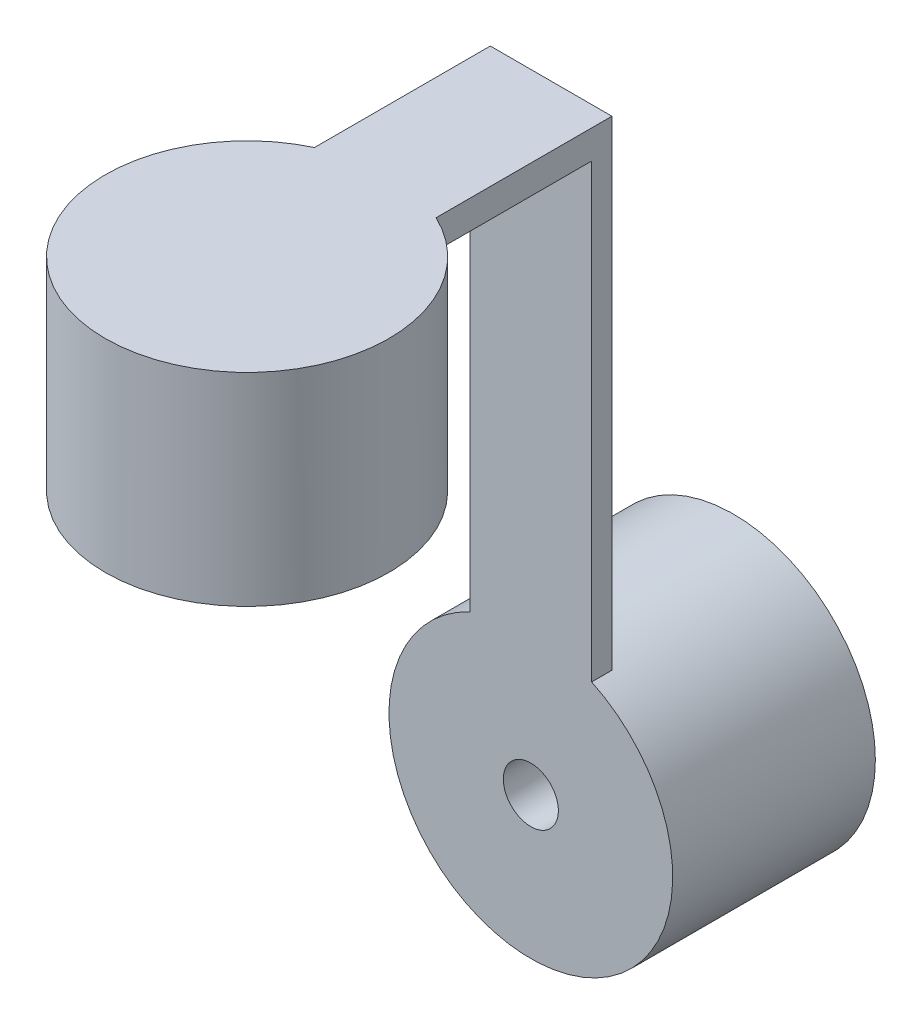
ISO-10303-21;
HEADER;
FILE_DESCRIPTION(('STEP AP214'),'2;1');
FILE_NAME('part.step','',(''),(''),'','','');
FILE_SCHEMA(('AUTOMOTIVE_DESIGN { 1 0 10303 214 1 1 1 1 }'));
ENDSEC;
DATA;
#1=APPLICATION_CONTEXT('core data for automotive mechanical design processes');
#2=APPLICATION_PROTOCOL_DEFINITION('international standard','automotive_design',2000,#1);
#3=PRODUCT_CONTEXT('',#1,'mechanical');
#4=PRODUCT('Part','Part','',(#3));
#5=PRODUCT_RELATED_PRODUCT_CATEGORY('part','',(#4));
#6=PRODUCT_DEFINITION_FORMATION('','',#4);
#7=PRODUCT_DEFINITION_CONTEXT('part definition',#1,'design');
#8=PRODUCT_DEFINITION('design','',#6,#7);
#9=PRODUCT_DEFINITION_SHAPE('','',#8);
#10=(LENGTH_UNIT() NAMED_UNIT(*) SI_UNIT(.MILLI.,.METRE.));
#11=(NAMED_UNIT(*) PLANE_ANGLE_UNIT() SI_UNIT($,.RADIAN.));
#12=(NAMED_UNIT(*) SI_UNIT($,.STERADIAN.) SOLID_ANGLE_UNIT());
#13=UNCERTAINTY_MEASURE_WITH_UNIT(LENGTH_MEASURE(1.E-05),#10,'distance_accuracy_value','');
#14=(GEOMETRIC_REPRESENTATION_CONTEXT(3) GLOBAL_UNCERTAINTY_ASSIGNED_CONTEXT((#13)) GLOBAL_UNIT_ASSIGNED_CONTEXT((#10,
#11,#12)) REPRESENTATION_CONTEXT('',''));
#15=CARTESIAN_POINT('',(0.,0.,0.));
#16=DIRECTION('',(0.,0.,1.));
#17=DIRECTION('',(1.,0.,0.));
#18=AXIS2_PLACEMENT_3D('',#15,#16,#17);
#19=CARTESIAN_POINT('',(0.,0.,50.));
#20=DIRECTION('',(0.,0.,-1.));
#21=DIRECTION('',(-1.,0.,0.));
#22=AXIS2_PLACEMENT_3D('',#19,#20,#21);
#23=CYLINDRICAL_SURFACE('',#22,35.);
#24=CARTESIAN_POINT('',(0.,0.,0.));
#25=DIRECTION('',(0.,0.,1.));
#26=DIRECTION('',(1.,0.,0.));
#27=AXIS2_PLACEMENT_3D('',#24,#25,#26);
#28=CIRCLE('',#27,35.);
#29=CARTESIAN_POINT('',(35.,0.,0.));
#30=VERTEX_POINT('',#29);
#31=EDGE_CURVE('E146',#30,#30,#28,.T.);
#32=ORIENTED_EDGE('',*,*,#31,.T.);
#33=EDGE_LOOP('',(#32));
#34=FACE_BOUND('',#33,.T.);
#35=DIRECTION('',(0.,0.,-1.));
#36=VECTOR('',#35,1.);
#37=CARTESIAN_POINT('',(-15.,31.6227766016838,50.));
#38=LINE('',#37,#36);
#39=CARTESIAN_POINT('',(-15.,31.6227766016838,45.));
#40=VERTEX_POINT('',#39);
#41=CARTESIAN_POINT('',(-15.,31.6227766016838,50.));
#42=VERTEX_POINT('',#41);
#43=EDGE_CURVE('E143',#40,#42,#38,.F.);
#44=ORIENTED_EDGE('',*,*,#43,.F.);
#45=CARTESIAN_POINT('',(0.,0.,45.));
#46=DIRECTION('',(0.,0.,1.));
#47=DIRECTION('',(1.,0.,0.));
#48=AXIS2_PLACEMENT_3D('',#45,#46,#47);
#49=CIRCLE('',#48,35.);
#50=CARTESIAN_POINT('',(15.,31.6227766016838,45.));
#51=VERTEX_POINT('',#50);
#52=EDGE_CURVE('E57',#51,#40,#49,.T.);
#53=ORIENTED_EDGE('',*,*,#52,.F.);
#54=DIRECTION('',(0.,0.,-1.));
#55=VECTOR('',#54,1.);
#56=CARTESIAN_POINT('',(15.,31.6227766016838,50.));
#57=LINE('',#56,#55);
#58=CARTESIAN_POINT('',(15.,31.6227766016838,50.));
#59=VERTEX_POINT('',#58);
#60=EDGE_CURVE('E141',#59,#51,#57,.T.);
#61=ORIENTED_EDGE('',*,*,#60,.F.);
#62=CARTESIAN_POINT('',(0.,0.,50.));
#63=DIRECTION('',(0.,0.,1.));
#64=DIRECTION('',(1.,0.,0.));
#65=AXIS2_PLACEMENT_3D('',#62,#63,#64);
#66=CIRCLE('',#65,35.);
#67=EDGE_CURVE('E120',#42,#59,#66,.T.);
#68=ORIENTED_EDGE('',*,*,#67,.F.);
#69=EDGE_LOOP('',(#44,#53,#61,#68));
#70=FACE_BOUND('',#69,.T.);
#71=ADVANCED_FACE('F50',(#34,#70),#23,.T.);
#72=CARTESIAN_POINT('',(0.,0.,50.));
#73=DIRECTION('',(0.,0.,1.));
#74=DIRECTION('',(1.,0.,0.));
#75=AXIS2_PLACEMENT_3D('',#72,#73,#74);
#76=PLANE('',#75);
#77=CARTESIAN_POINT('',(0.,0.,50.));
#78=DIRECTION('',(0.,0.,-1.));
#79=DIRECTION('',(-1.,0.,0.));
#80=AXIS2_PLACEMENT_3D('',#77,#78,#79);
#81=CIRCLE('',#80,6.79133894390749);
#82=CARTESIAN_POINT('',(-6.79133894390749,0.,50.));
#83=VERTEX_POINT('',#82);
#84=EDGE_CURVE('E164',#83,#83,#81,.T.);
#85=ORIENTED_EDGE('',*,*,#84,.T.);
#86=EDGE_LOOP('',(#85));
#87=FACE_BOUND('',#86,.T.);
#88=DIRECTION('',(1.,0.,0.));
#89=VECTOR('',#88,1.);
#90=CARTESIAN_POINT('',(-15.,142.920863382038,50.));
#91=LINE('',#90,#89);
#92=CARTESIAN_POINT('',(-15.,142.920863382038,50.));
#93=VERTEX_POINT('',#92);
#94=CARTESIAN_POINT('',(15.,142.920863382038,50.));
#95=VERTEX_POINT('',#94);
#96=EDGE_CURVE('E112',#93,#95,#91,.T.);
#97=ORIENTED_EDGE('',*,*,#96,.F.);
#98=DIRECTION('',(0.,-1.,0.));
#99=VECTOR('',#98,1.);
#100=CARTESIAN_POINT('',(-15.,150.,50.));
#101=LINE('',#100,#99);
#102=EDGE_CURVE('E121',#93,#42,#101,.T.);
#103=ORIENTED_EDGE('',*,*,#102,.T.);
#104=ORIENTED_EDGE('',*,*,#67,.T.);
#105=DIRECTION('',(0.,-1.,0.));
#106=VECTOR('',#105,1.);
#107=CARTESIAN_POINT('',(15.,150.,50.));
#108=LINE('',#107,#106);
#109=EDGE_CURVE('E105',#95,#59,#108,.T.);
#110=ORIENTED_EDGE('',*,*,#109,.F.);
#111=EDGE_LOOP('',(#97,#103,#104,#110));
#112=FACE_BOUND('',#111,.T.);
#113=ADVANCED_FACE('F117',(#87,#112),#76,.T.);
#114=CARTESIAN_POINT('',(0.,0.,0.));
#115=DIRECTION('',(0.,0.,1.));
#116=DIRECTION('',(1.,0.,0.));
#117=AXIS2_PLACEMENT_3D('',#114,#115,#116);
#118=PLANE('',#117);
#119=CARTESIAN_POINT('',(0.,0.,0.));
#120=DIRECTION('',(0.,0.,-1.));
#121=DIRECTION('',(-1.,0.,0.));
#122=AXIS2_PLACEMENT_3D('',#119,#120,#121);
#123=CIRCLE('',#122,6.79133894390749);
#124=CARTESIAN_POINT('',(-6.79133894390749,0.,0.));
#125=VERTEX_POINT('',#124);
#126=EDGE_CURVE('E169',#125,#125,#123,.T.);
#127=ORIENTED_EDGE('',*,*,#126,.F.);
#128=EDGE_LOOP('',(#127));
#129=FACE_BOUND('',#128,.T.);
#130=ORIENTED_EDGE('',*,*,#31,.F.);
#131=EDGE_LOOP('',(#130));
#132=FACE_BOUND('',#131,.T.);
#133=ADVANCED_FACE('F207',(#129,#132),#118,.F.);
#134=CARTESIAN_POINT('',(-15.,150.,50.));
#135=DIRECTION('',(1.,0.,0.));
#136=DIRECTION('',(0.,0.,-1.));
#137=AXIS2_PLACEMENT_3D('',#134,#135,#136);
#138=PLANE('',#137);
#139=DIRECTION('',(0.,0.,-1.));
#140=VECTOR('',#139,1.);
#141=CARTESIAN_POINT('',(-15.,142.920863382038,120.));
#142=LINE('',#141,#140);
#143=CARTESIAN_POINT('',(-15.,142.920863382038,88.3772233983162));
#144=VERTEX_POINT('',#143);
#145=EDGE_CURVE('E111',#144,#93,#142,.T.);
#146=ORIENTED_EDGE('',*,*,#145,.F.);
#147=DIRECTION('',(0.,1.,0.));
#148=VECTOR('',#147,1.);
#149=CARTESIAN_POINT('',(-15.,100.,88.3772233983162));
#150=LINE('',#149,#148);
#151=CARTESIAN_POINT('',(-15.,150.,88.3772233983162));
#152=VERTEX_POINT('',#151);
#153=EDGE_CURVE('E72',#144,#152,#150,.T.);
#154=ORIENTED_EDGE('',*,*,#153,.T.);
#155=DIRECTION('',(0.,0.,1.));
#156=VECTOR('',#155,1.);
#157=CARTESIAN_POINT('',(-15.,150.,50.));
#158=LINE('',#157,#156);
#159=CARTESIAN_POINT('',(-15.,150.,45.));
#160=VERTEX_POINT('',#159);
#161=EDGE_CURVE('E130',#160,#152,#158,.T.);
#162=ORIENTED_EDGE('',*,*,#161,.F.);
#163=DIRECTION('',(0.,-1.,0.));
#164=VECTOR('',#163,1.);
#165=CARTESIAN_POINT('',(-15.,150.,45.));
#166=LINE('',#165,#164);
#167=EDGE_CURVE('E135',#160,#40,#166,.T.);
#168=ORIENTED_EDGE('',*,*,#167,.T.);
#169=ORIENTED_EDGE('',*,*,#43,.T.);
#170=ORIENTED_EDGE('',*,*,#102,.F.);
#171=EDGE_LOOP('',(#146,#154,#162,#168,#169,#170));
#172=FACE_BOUND('',#171,.T.);
#173=ADVANCED_FACE('F155',(#172),#138,.F.);
#174=CARTESIAN_POINT('',(15.,150.,50.));
#175=DIRECTION('',(-1.,0.,0.));
#176=DIRECTION('',(0.,0.,1.));
#177=AXIS2_PLACEMENT_3D('',#174,#175,#176);
#178=PLANE('',#177);
#179=DIRECTION('',(0.,0.,-1.));
#180=VECTOR('',#179,1.);
#181=CARTESIAN_POINT('',(15.,150.,50.));
#182=LINE('',#181,#180);
#183=CARTESIAN_POINT('',(15.,150.,88.3772233983162));
#184=VERTEX_POINT('',#183);
#185=CARTESIAN_POINT('',(15.,150.,45.));
#186=VERTEX_POINT('',#185);
#187=EDGE_CURVE('E64',#184,#186,#182,.T.);
#188=ORIENTED_EDGE('',*,*,#187,.F.);
#189=DIRECTION('',(0.,1.,0.));
#190=VECTOR('',#189,1.);
#191=CARTESIAN_POINT('',(15.,100.,88.3772233983162));
#192=LINE('',#191,#190);
#193=CARTESIAN_POINT('',(15.,142.920863382038,88.3772233983162));
#194=VERTEX_POINT('',#193);
#195=EDGE_CURVE('E107',#184,#194,#192,.F.);
#196=ORIENTED_EDGE('',*,*,#195,.T.);
#197=DIRECTION('',(0.,0.,-1.));
#198=VECTOR('',#197,1.);
#199=CARTESIAN_POINT('',(15.,142.920863382038,120.));
#200=LINE('',#199,#198);
#201=EDGE_CURVE('E101',#194,#95,#200,.T.);
#202=ORIENTED_EDGE('',*,*,#201,.T.);
#203=ORIENTED_EDGE('',*,*,#109,.T.);
#204=ORIENTED_EDGE('',*,*,#60,.T.);
#205=DIRECTION('',(0.,-1.,0.));
#206=VECTOR('',#205,1.);
#207=CARTESIAN_POINT('',(15.,150.,45.));
#208=LINE('',#207,#206);
#209=EDGE_CURVE('E122',#186,#51,#208,.T.);
#210=ORIENTED_EDGE('',*,*,#209,.F.);
#211=EDGE_LOOP('',(#188,#196,#202,#203,#204,#210));
#212=FACE_BOUND('',#211,.T.);
#213=ADVANCED_FACE('F103',(#212),#178,.F.);
#214=CARTESIAN_POINT('',(-15.,150.,45.));
#215=DIRECTION('',(0.,0.,1.));
#216=DIRECTION('',(1.,0.,0.));
#217=AXIS2_PLACEMENT_3D('',#214,#215,#216);
#218=PLANE('',#217);
#219=ORIENTED_EDGE('',*,*,#209,.T.);
#220=ORIENTED_EDGE('',*,*,#52,.T.);
#221=ORIENTED_EDGE('',*,*,#167,.F.);
#222=DIRECTION('',(-1.,0.,0.));
#223=VECTOR('',#222,1.);
#224=CARTESIAN_POINT('',(-15.,150.,45.));
#225=LINE('',#224,#223);
#226=EDGE_CURVE('E133',#186,#160,#225,.T.);
#227=ORIENTED_EDGE('',*,*,#226,.F.);
#228=EDGE_LOOP('',(#219,#220,#221,#227));
#229=FACE_BOUND('',#228,.T.);
#230=ADVANCED_FACE('F152',(#229),#218,.F.);
#231=CARTESIAN_POINT('',(0.,150.,0.));
#232=DIRECTION('',(0.,-1.,0.));
#233=DIRECTION('',(0.,0.,-1.));
#234=AXIS2_PLACEMENT_3D('',#231,#232,#233);
#235=PLANE('',#234);
#236=CARTESIAN_POINT('',(0.,150.,120.));
#237=DIRECTION('',(0.,1.,0.));
#238=DIRECTION('',(0.,0.,1.));
#239=AXIS2_PLACEMENT_3D('',#236,#237,#238);
#240=CIRCLE('',#239,35.);
#241=EDGE_CURVE('E160',#152,#184,#240,.T.);
#242=ORIENTED_EDGE('',*,*,#241,.T.);
#243=ORIENTED_EDGE('',*,*,#187,.T.);
#244=ORIENTED_EDGE('',*,*,#226,.T.);
#245=ORIENTED_EDGE('',*,*,#161,.T.);
#246=EDGE_LOOP('',(#242,#243,#244,#245));
#247=FACE_BOUND('',#246,.T.);
#248=ADVANCED_FACE('F159',(#247),#235,.F.);
#249=CARTESIAN_POINT('',(-15.,142.920863382038,120.));
#250=DIRECTION('',(0.,1.,0.));
#251=DIRECTION('',(0.,0.,1.));
#252=AXIS2_PLACEMENT_3D('',#249,#250,#251);
#253=PLANE('',#252);
#254=ORIENTED_EDGE('',*,*,#201,.F.);
#255=CARTESIAN_POINT('',(0.,142.920863382038,120.));
#256=DIRECTION('',(0.,1.,0.));
#257=DIRECTION('',(0.,0.,1.));
#258=AXIS2_PLACEMENT_3D('',#255,#256,#257);
#259=CIRCLE('',#258,35.);
#260=EDGE_CURVE('E13',#194,#144,#259,.T.);
#261=ORIENTED_EDGE('',*,*,#260,.T.);
#262=ORIENTED_EDGE('',*,*,#145,.T.);
#263=ORIENTED_EDGE('',*,*,#96,.T.);
#264=EDGE_LOOP('',(#254,#261,#262,#263));
#265=FACE_BOUND('',#264,.T.);
#266=ADVANCED_FACE('F124',(#265),#253,.F.);
#267=CARTESIAN_POINT('',(0.,100.,120.));
#268=DIRECTION('',(0.,1.,0.));
#269=DIRECTION('',(0.,0.,1.));
#270=AXIS2_PLACEMENT_3D('',#267,#268,#269);
#271=CYLINDRICAL_SURFACE('',#270,35.);
#272=CARTESIAN_POINT('',(0.,100.,120.));
#273=DIRECTION('',(0.,1.,0.));
#274=DIRECTION('',(0.,0.,1.));
#275=AXIS2_PLACEMENT_3D('',#272,#273,#274);
#276=CIRCLE('',#275,35.);
#277=CARTESIAN_POINT('',(0.,100.,155.));
#278=VERTEX_POINT('',#277);
#279=EDGE_CURVE('E163',#278,#278,#276,.T.);
#280=ORIENTED_EDGE('',*,*,#279,.T.);
#281=EDGE_LOOP('',(#280));
#282=FACE_BOUND('',#281,.T.);
#283=ORIENTED_EDGE('',*,*,#153,.F.);
#284=ORIENTED_EDGE('',*,*,#260,.F.);
#285=ORIENTED_EDGE('',*,*,#195,.F.);
#286=ORIENTED_EDGE('',*,*,#241,.F.);
#287=EDGE_LOOP('',(#283,#284,#285,#286));
#288=FACE_BOUND('',#287,.T.);
#289=ADVANCED_FACE('F162',(#282,#288),#271,.T.);
#290=CARTESIAN_POINT('',(0.,100.,120.));
#291=DIRECTION('',(0.,1.,0.));
#292=DIRECTION('',(0.,0.,1.));
#293=AXIS2_PLACEMENT_3D('',#290,#291,#292);
#294=PLANE('',#293);
#295=CARTESIAN_POINT('',(0.,100.,120.));
#296=DIRECTION('',(0.,-1.,0.));
#297=DIRECTION('',(0.,0.,-1.));
#298=AXIS2_PLACEMENT_3D('',#295,#296,#297);
#299=CIRCLE('',#298,5.);
#300=CARTESIAN_POINT('',(0.,100.,115.));
#301=VERTEX_POINT('',#300);
#302=EDGE_CURVE('E175',#301,#301,#299,.T.);
#303=ORIENTED_EDGE('',*,*,#302,.F.);
#304=EDGE_LOOP('',(#303));
#305=FACE_BOUND('',#304,.T.);
#306=ORIENTED_EDGE('',*,*,#279,.F.);
#307=EDGE_LOOP('',(#306));
#308=FACE_BOUND('',#307,.T.);
#309=ADVANCED_FACE('F190',(#305,#308),#294,.F.);
#310=CARTESIAN_POINT('',(0.,0.,50.));
#311=DIRECTION('',(0.,0.,-1.));
#312=DIRECTION('',(-1.,0.,0.));
#313=AXIS2_PLACEMENT_3D('',#310,#311,#312);
#314=CYLINDRICAL_SURFACE('',#313,6.79133894390749);
#315=ORIENTED_EDGE('',*,*,#84,.F.);
#316=EDGE_LOOP('',(#315));
#317=FACE_BOUND('',#316,.T.);
#318=ORIENTED_EDGE('',*,*,#126,.T.);
#319=EDGE_LOOP('',(#318));
#320=FACE_BOUND('',#319,.T.);
#321=ADVANCED_FACE('F186',(#317,#320),#314,.F.);
#322=CARTESIAN_POINT('',(0.,110.,120.));
#323=DIRECTION('',(0.,-1.,0.));
#324=DIRECTION('',(0.,0.,-1.));
#325=AXIS2_PLACEMENT_3D('',#322,#323,#324);
#326=CYLINDRICAL_SURFACE('',#325,5.);
#327=CARTESIAN_POINT('',(0.,110.,120.));
#328=DIRECTION('',(0.,-1.,0.));
#329=DIRECTION('',(0.,0.,-1.));
#330=AXIS2_PLACEMENT_3D('',#327,#328,#329);
#331=CIRCLE('',#330,5.);
#332=CARTESIAN_POINT('',(0.,110.,115.));
#333=VERTEX_POINT('',#332);
#334=EDGE_CURVE('E173',#333,#333,#331,.T.);
#335=CARTESIAN_POINT('',(0.,110.,115.));
#336=CARTESIAN_POINT('',(0.,109.895833333333,115.));
#337=CARTESIAN_POINT('',(0.,109.791666666667,115.));
#338=CARTESIAN_POINT('',(0.,109.583333333333,115.));
#339=CARTESIAN_POINT('',(0.,109.479166666667,115.));
#340=CARTESIAN_POINT('',(0.,109.270833333333,115.));
#341=CARTESIAN_POINT('',(0.,109.166666666667,115.));
#342=CARTESIAN_POINT('',(0.,108.958333333333,115.));
#343=CARTESIAN_POINT('',(0.,108.854166666667,115.));
#344=CARTESIAN_POINT('',(0.,108.645833333333,115.));
#345=CARTESIAN_POINT('',(0.,108.541666666667,115.));
#346=CARTESIAN_POINT('',(0.,108.333333333333,115.));
#347=CARTESIAN_POINT('',(0.,108.229166666667,115.));
#348=CARTESIAN_POINT('',(0.,108.020833333333,115.));
#349=CARTESIAN_POINT('',(0.,107.916666666667,115.));
#350=CARTESIAN_POINT('',(0.,107.708333333333,115.));
#351=CARTESIAN_POINT('',(0.,107.604166666667,115.));
#352=CARTESIAN_POINT('',(0.,107.395833333333,115.));
#353=CARTESIAN_POINT('',(0.,107.291666666667,115.));
#354=CARTESIAN_POINT('',(0.,107.083333333333,115.));
#355=CARTESIAN_POINT('',(0.,106.979166666667,115.));
#356=CARTESIAN_POINT('',(0.,106.770833333333,115.));
#357=CARTESIAN_POINT('',(0.,106.666666666667,115.));
#358=CARTESIAN_POINT('',(0.,106.458333333333,115.));
#359=CARTESIAN_POINT('',(0.,106.354166666667,115.));
#360=CARTESIAN_POINT('',(0.,106.145833333333,115.));
#361=CARTESIAN_POINT('',(0.,106.041666666667,115.));
#362=CARTESIAN_POINT('',(0.,105.833333333333,115.));
#363=CARTESIAN_POINT('',(0.,105.729166666667,115.));
#364=CARTESIAN_POINT('',(0.,105.520833333333,115.));
#365=CARTESIAN_POINT('',(0.,105.416666666667,115.));
#366=CARTESIAN_POINT('',(0.,105.208333333333,115.));
#367=CARTESIAN_POINT('',(0.,105.104166666667,115.));
#368=CARTESIAN_POINT('',(0.,104.895833333333,115.));
#369=CARTESIAN_POINT('',(0.,104.791666666667,115.));
#370=CARTESIAN_POINT('',(0.,104.583333333333,115.));
#371=CARTESIAN_POINT('',(0.,104.479166666667,115.));
#372=CARTESIAN_POINT('',(0.,104.270833333333,115.));
#373=CARTESIAN_POINT('',(0.,104.166666666667,115.));
#374=CARTESIAN_POINT('',(0.,103.958333333333,115.));
#375=CARTESIAN_POINT('',(0.,103.854166666667,115.));
#376=CARTESIAN_POINT('',(0.,103.645833333333,115.));
#377=CARTESIAN_POINT('',(0.,103.541666666667,115.));
#378=CARTESIAN_POINT('',(0.,103.333333333333,115.));
#379=CARTESIAN_POINT('',(0.,103.229166666667,115.));
#380=CARTESIAN_POINT('',(0.,103.020833333333,115.));
#381=CARTESIAN_POINT('',(0.,102.916666666667,115.));
#382=CARTESIAN_POINT('',(0.,102.708333333333,115.));
#383=CARTESIAN_POINT('',(0.,102.604166666667,115.));
#384=CARTESIAN_POINT('',(0.,102.395833333333,115.));
#385=CARTESIAN_POINT('',(0.,102.291666666667,115.));
#386=CARTESIAN_POINT('',(0.,102.083333333333,115.));
#387=CARTESIAN_POINT('',(0.,101.979166666667,115.));
#388=CARTESIAN_POINT('',(0.,101.770833333333,115.));
#389=CARTESIAN_POINT('',(0.,101.666666666667,115.));
#390=CARTESIAN_POINT('',(0.,101.458333333333,115.));
#391=CARTESIAN_POINT('',(0.,101.354166666667,115.));
#392=CARTESIAN_POINT('',(0.,101.145833333333,115.));
#393=CARTESIAN_POINT('',(0.,101.041666666667,115.));
#394=CARTESIAN_POINT('',(0.,100.833333333333,115.));
#395=CARTESIAN_POINT('',(0.,100.729166666667,115.));
#396=CARTESIAN_POINT('',(0.,100.520833333333,115.));
#397=CARTESIAN_POINT('',(0.,100.416666666667,115.));
#398=CARTESIAN_POINT('',(0.,100.208333333333,115.));
#399=CARTESIAN_POINT('',(0.,100.104166666667,115.));
#400=CARTESIAN_POINT('',(0.,100.,115.));
#401=B_SPLINE_CURVE_WITH_KNOTS('',3,(#335,#336,#337,#338,#339,#340,#341,#342,#343,#344,#345,
#346,#347,#348,#349,#350,#351,#352,#353,#354,#355,#356,#357,#358,#359,#360,#361,#362,#363,#364,
#365,#366,#367,#368,#369,#370,#371,#372,#373,#374,#375,#376,#377,#378,#379,#380,#381,#382,#383,
#384,#385,#386,#387,#388,#389,#390,#391,#392,#393,#394,#395,#396,#397,#398,#399,#400),
.UNSPECIFIED.,.F.,.F.,(4,2,2,2,2,2,2,2,2,2,2,2,2,2,2,2,2,2,2,2,2,2,2,2,2,2,2,2,2,2,2,2,4),(0.,
0.312499999999993,0.625000000000001,0.937499999999994,1.25,1.56249999999999,1.875,2.1875,2.5,
2.8125,3.125,3.4375,3.75,4.0625,4.375,4.6875,5.,5.3125,5.62500000000001,5.9375,6.25000000000001,
6.5625,6.87500000000001,7.1875,7.50000000000001,7.8125,8.12500000000001,8.4375,8.75000000000001,
9.0625,9.37500000000001,9.6875,10.),.UNSPECIFIED.);
#402=EDGE_CURVE('BSEAM183',#333,#301,#401,.T.);
#403=ORIENTED_EDGE('',*,*,#334,.F.);
#404=ORIENTED_EDGE('',*,*,#302,.T.);
#405=ORIENTED_EDGE('',*,*,#402,.T.);
#406=ORIENTED_EDGE('',*,*,#402,.F.);
#407=EDGE_LOOP('',(#403,#405,#404,#406));
#408=FACE_BOUND('',#407,.T.);
#409=ADVANCED_FACE('F183',(#408),#326,.F.);
#410=CARTESIAN_POINT('',(0.,110.,120.));
#411=DIRECTION('',(0.,-1.,0.));
#412=DIRECTION('',(0.,0.,-1.));
#413=AXIS2_PLACEMENT_3D('',#410,#411,#412);
#414=PLANE('',#413);
#415=ORIENTED_EDGE('',*,*,#334,.T.);
#416=EDGE_LOOP('',(#415));
#417=FACE_BOUND('',#416,.T.);
#418=ADVANCED_FACE('F181',(#417),#414,.T.);
#419=CLOSED_SHELL('',(#71,#113,#133,#173,#213,#230,#248,#266,#289,#309,#321,#409,#418));
#420=MANIFOLD_SOLID_BREP('B2',#419);
#421=ADVANCED_BREP_SHAPE_REPRESENTATION('',(#18,#420),#14);
#422=SHAPE_DEFINITION_REPRESENTATION(#9,#421);
ENDSEC;
END-ISO-10303-21;
